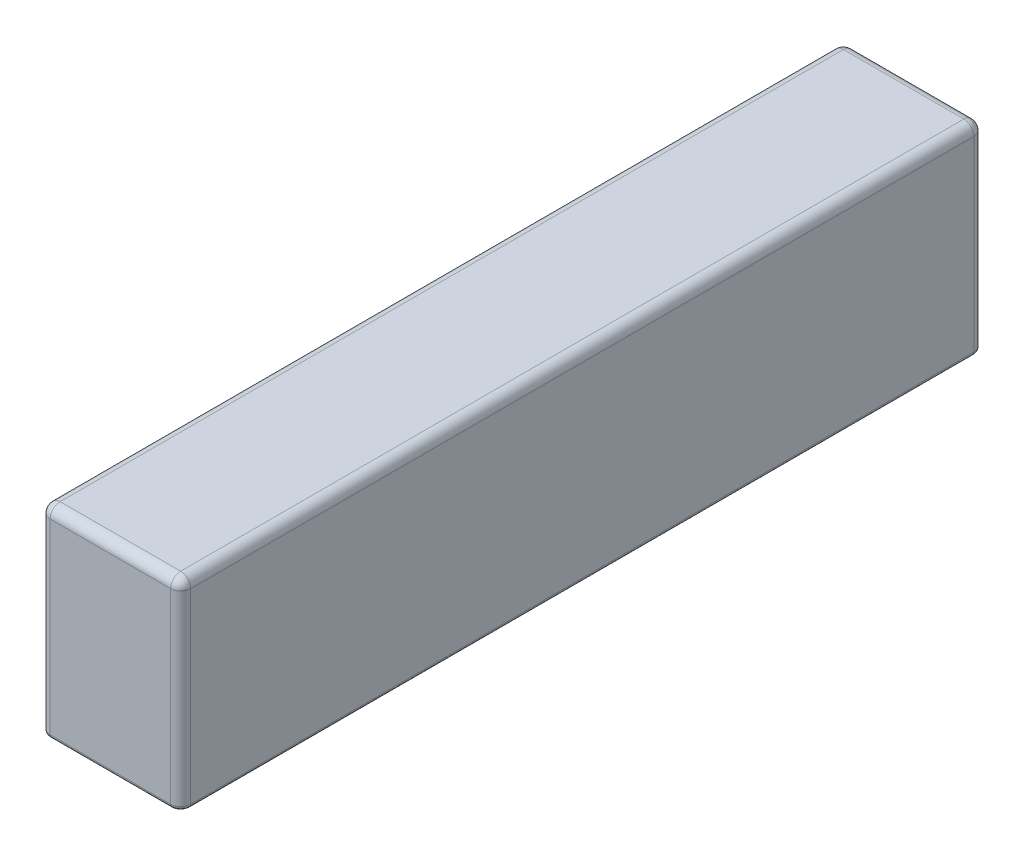
ISO-10303-21;
HEADER;
FILE_DESCRIPTION(('STEP AP214'),'2;1');
FILE_NAME('part.step','',(''),(''),'','','');
FILE_SCHEMA(('AUTOMOTIVE_DESIGN { 1 0 10303 214 1 1 1 1 }'));
ENDSEC;
DATA;
#1=APPLICATION_CONTEXT('core data for automotive mechanical design processes');
#2=APPLICATION_PROTOCOL_DEFINITION('international standard','automotive_design',2000,#1);
#3=PRODUCT_CONTEXT('',#1,'mechanical');
#4=PRODUCT('Part','Part','',(#3));
#5=PRODUCT_RELATED_PRODUCT_CATEGORY('part','',(#4));
#6=PRODUCT_DEFINITION_FORMATION('','',#4);
#7=PRODUCT_DEFINITION_CONTEXT('part definition',#1,'design');
#8=PRODUCT_DEFINITION('design','',#6,#7);
#9=PRODUCT_DEFINITION_SHAPE('','',#8);
#10=(LENGTH_UNIT() NAMED_UNIT(*) SI_UNIT(.MILLI.,.METRE.));
#11=(NAMED_UNIT(*) PLANE_ANGLE_UNIT() SI_UNIT($,.RADIAN.));
#12=(NAMED_UNIT(*) SI_UNIT($,.STERADIAN.) SOLID_ANGLE_UNIT());
#13=UNCERTAINTY_MEASURE_WITH_UNIT(LENGTH_MEASURE(1.E-05),#10,'distance_accuracy_value','');
#14=(GEOMETRIC_REPRESENTATION_CONTEXT(3) GLOBAL_UNCERTAINTY_ASSIGNED_CONTEXT((#13)) GLOBAL_UNIT_ASSIGNED_CONTEXT((#10,
#11,#12)) REPRESENTATION_CONTEXT('',''));
#15=CARTESIAN_POINT('',(0.,0.,0.));
#16=DIRECTION('',(0.,0.,1.));
#17=DIRECTION('',(1.,0.,0.));
#18=AXIS2_PLACEMENT_3D('',#15,#16,#17);
#19=CARTESIAN_POINT('',(3.5,5.,20.));
#20=DIRECTION('',(-1.,0.,0.));
#21=DIRECTION('',(0.,0.,1.));
#22=AXIS2_PLACEMENT_3D('',#19,#20,#21);
#23=PLANE('',#22);
#24=DIRECTION('',(0.,-1.,0.));
#25=VECTOR('',#24,1.);
#26=CARTESIAN_POINT('',(3.5,5.,19.5));
#27=LINE('',#26,#25);
#28=CARTESIAN_POINT('',(3.5,4.5,19.5));
#29=VERTEX_POINT('',#28);
#30=CARTESIAN_POINT('',(3.5,-4.8,19.5));
#31=VERTEX_POINT('',#30);
#32=EDGE_CURVE('E192',#29,#31,#27,.T.);
#33=ORIENTED_EDGE('',*,*,#32,.T.);
#34=DIRECTION('',(0.,0.,-1.));
#35=VECTOR('',#34,1.);
#36=CARTESIAN_POINT('',(3.5,-4.8,-19.5));
#37=LINE('',#36,#35);
#38=CARTESIAN_POINT('',(3.5,-4.8,-19.5));
#39=VERTEX_POINT('',#38);
#40=EDGE_CURVE('E69',#31,#39,#37,.T.);
#41=ORIENTED_EDGE('',*,*,#40,.T.);
#42=DIRECTION('',(0.,-1.,0.));
#43=VECTOR('',#42,1.);
#44=CARTESIAN_POINT('',(3.5,5.,-19.5));
#45=LINE('',#44,#43);
#46=CARTESIAN_POINT('',(3.5,4.5,-19.5));
#47=VERTEX_POINT('',#46);
#48=EDGE_CURVE('E194',#39,#47,#45,.F.);
#49=ORIENTED_EDGE('',*,*,#48,.T.);
#50=DIRECTION('',(0.,0.,-1.));
#51=VECTOR('',#50,1.);
#52=CARTESIAN_POINT('',(3.5,4.5,20.));
#53=LINE('',#52,#51);
#54=EDGE_CURVE('E190',#47,#29,#53,.F.);
#55=ORIENTED_EDGE('',*,*,#54,.T.);
#56=EDGE_LOOP('',(#33,#41,#49,#55));
#57=FACE_BOUND('',#56,.T.);
#58=ADVANCED_FACE('F45',(#57),#23,.F.);
#59=CARTESIAN_POINT('',(-3.5,5.,-20.));
#60=DIRECTION('',(0.,0.,1.));
#61=DIRECTION('',(1.,0.,0.));
#62=AXIS2_PLACEMENT_3D('',#59,#60,#61);
#63=PLANE('',#62);
#64=DIRECTION('',(0.,-1.,0.));
#65=VECTOR('',#64,1.);
#66=CARTESIAN_POINT('',(3.,5.,-20.));
#67=LINE('',#66,#65);
#68=CARTESIAN_POINT('',(3.,4.5,-20.));
#69=VERTEX_POINT('',#68);
#70=CARTESIAN_POINT('',(3.,-4.8,-20.));
#71=VERTEX_POINT('',#70);
#72=EDGE_CURVE('E157',#69,#71,#67,.T.);
#73=ORIENTED_EDGE('',*,*,#72,.T.);
#74=DIRECTION('',(-1.,0.,0.));
#75=VECTOR('',#74,1.);
#76=CARTESIAN_POINT('',(-3.,-4.8,-20.));
#77=LINE('',#76,#75);
#78=CARTESIAN_POINT('',(-3.,-4.8,-20.));
#79=VERTEX_POINT('',#78);
#80=EDGE_CURVE('E11',#71,#79,#77,.T.);
#81=ORIENTED_EDGE('',*,*,#80,.T.);
#82=DIRECTION('',(0.,-1.,0.));
#83=VECTOR('',#82,1.);
#84=CARTESIAN_POINT('',(-3.,5.,-20.));
#85=LINE('',#84,#83);
#86=CARTESIAN_POINT('',(-3.,4.5,-20.));
#87=VERTEX_POINT('',#86);
#88=EDGE_CURVE('E147',#79,#87,#85,.F.);
#89=ORIENTED_EDGE('',*,*,#88,.T.);
#90=DIRECTION('',(-1.,0.,0.));
#91=VECTOR('',#90,1.);
#92=CARTESIAN_POINT('',(-3.5,4.5,-20.));
#93=LINE('',#92,#91);
#94=EDGE_CURVE('E151',#87,#69,#93,.F.);
#95=ORIENTED_EDGE('',*,*,#94,.T.);
#96=EDGE_LOOP('',(#73,#81,#89,#95));
#97=FACE_BOUND('',#96,.T.);
#98=ADVANCED_FACE('F149',(#97),#63,.F.);
#99=CARTESIAN_POINT('',(-3.5,5.,20.));
#100=DIRECTION('',(1.,0.,0.));
#101=DIRECTION('',(0.,0.,-1.));
#102=AXIS2_PLACEMENT_3D('',#99,#100,#101);
#103=PLANE('',#102);
#104=DIRECTION('',(0.,-1.,0.));
#105=VECTOR('',#104,1.);
#106=CARTESIAN_POINT('',(-3.5,5.,-19.5));
#107=LINE('',#106,#105);
#108=CARTESIAN_POINT('',(-3.5,4.5,-19.5));
#109=VERTEX_POINT('',#108);
#110=CARTESIAN_POINT('',(-3.5,-4.8,-19.5));
#111=VERTEX_POINT('',#110);
#112=EDGE_CURVE('E165',#109,#111,#107,.T.);
#113=ORIENTED_EDGE('',*,*,#112,.T.);
#114=DIRECTION('',(0.,0.,1.));
#115=VECTOR('',#114,1.);
#116=CARTESIAN_POINT('',(-3.5,-4.8,19.5));
#117=LINE('',#116,#115);
#118=CARTESIAN_POINT('',(-3.5,-4.8,19.5));
#119=VERTEX_POINT('',#118);
#120=EDGE_CURVE('E256',#111,#119,#117,.T.);
#121=ORIENTED_EDGE('',*,*,#120,.T.);
#122=DIRECTION('',(0.,-1.,0.));
#123=VECTOR('',#122,1.);
#124=CARTESIAN_POINT('',(-3.5,5.,19.5));
#125=LINE('',#124,#123);
#126=CARTESIAN_POINT('',(-3.5,4.5,19.5));
#127=VERTEX_POINT('',#126);
#128=EDGE_CURVE('E206',#119,#127,#125,.F.);
#129=ORIENTED_EDGE('',*,*,#128,.T.);
#130=DIRECTION('',(0.,0.,1.));
#131=VECTOR('',#130,1.);
#132=CARTESIAN_POINT('',(-3.5,4.5,20.));
#133=LINE('',#132,#131);
#134=EDGE_CURVE('E203',#127,#109,#133,.F.);
#135=ORIENTED_EDGE('',*,*,#134,.T.);
#136=EDGE_LOOP('',(#113,#121,#129,#135));
#137=FACE_BOUND('',#136,.T.);
#138=ADVANCED_FACE('F325',(#137),#103,.F.);
#139=CARTESIAN_POINT('',(-3.5,5.,20.));
#140=DIRECTION('',(0.,0.,-1.));
#141=DIRECTION('',(-1.,0.,0.));
#142=AXIS2_PLACEMENT_3D('',#139,#140,#141);
#143=PLANE('',#142);
#144=DIRECTION('',(0.,-1.,0.));
#145=VECTOR('',#144,1.);
#146=CARTESIAN_POINT('',(-3.,5.,20.));
#147=LINE('',#146,#145);
#148=CARTESIAN_POINT('',(-3.,4.5,20.));
#149=VERTEX_POINT('',#148);
#150=CARTESIAN_POINT('',(-3.,-4.8,20.));
#151=VERTEX_POINT('',#150);
#152=EDGE_CURVE('E198',#149,#151,#147,.T.);
#153=ORIENTED_EDGE('',*,*,#152,.T.);
#154=DIRECTION('',(1.,0.,0.));
#155=VECTOR('',#154,1.);
#156=CARTESIAN_POINT('',(3.,-4.8,20.));
#157=LINE('',#156,#155);
#158=CARTESIAN_POINT('',(3.,-4.8,20.));
#159=VERTEX_POINT('',#158);
#160=EDGE_CURVE('E260',#151,#159,#157,.T.);
#161=ORIENTED_EDGE('',*,*,#160,.T.);
#162=DIRECTION('',(0.,-1.,0.));
#163=VECTOR('',#162,1.);
#164=CARTESIAN_POINT('',(3.,5.,20.));
#165=LINE('',#164,#163);
#166=CARTESIAN_POINT('',(3.,4.5,20.));
#167=VERTEX_POINT('',#166);
#168=EDGE_CURVE('E201',#159,#167,#165,.F.);
#169=ORIENTED_EDGE('',*,*,#168,.T.);
#170=DIRECTION('',(1.,0.,0.));
#171=VECTOR('',#170,1.);
#172=CARTESIAN_POINT('',(-3.5,4.5,20.));
#173=LINE('',#172,#171);
#174=EDGE_CURVE('E196',#167,#149,#173,.F.);
#175=ORIENTED_EDGE('',*,*,#174,.T.);
#176=EDGE_LOOP('',(#153,#161,#169,#175));
#177=FACE_BOUND('',#176,.T.);
#178=ADVANCED_FACE('F500',(#177),#143,.F.);
#179=CARTESIAN_POINT('',(0.,5.,0.));
#180=DIRECTION('',(0.,-1.,0.));
#181=DIRECTION('',(0.,0.,-1.));
#182=AXIS2_PLACEMENT_3D('',#179,#180,#181);
#183=PLANE('',#182);
#184=DIRECTION('',(0.,0.,-1.));
#185=VECTOR('',#184,1.);
#186=CARTESIAN_POINT('',(3.,5.,0.));
#187=LINE('',#186,#185);
#188=CARTESIAN_POINT('',(3.,5.,19.5));
#189=VERTEX_POINT('',#188);
#190=CARTESIAN_POINT('',(3.,5.,-19.5));
#191=VERTEX_POINT('',#190);
#192=EDGE_CURVE('E212',#189,#191,#187,.T.);
#193=ORIENTED_EDGE('',*,*,#192,.T.);
#194=DIRECTION('',(-1.,0.,0.));
#195=VECTOR('',#194,1.);
#196=CARTESIAN_POINT('',(0.,5.,-19.5));
#197=LINE('',#196,#195);
#198=CARTESIAN_POINT('',(-3.,5.,-19.5));
#199=VERTEX_POINT('',#198);
#200=EDGE_CURVE('E214',#191,#199,#197,.T.);
#201=ORIENTED_EDGE('',*,*,#200,.T.);
#202=DIRECTION('',(0.,0.,1.));
#203=VECTOR('',#202,1.);
#204=CARTESIAN_POINT('',(-3.,5.,0.));
#205=LINE('',#204,#203);
#206=CARTESIAN_POINT('',(-3.,5.,19.5));
#207=VERTEX_POINT('',#206);
#208=EDGE_CURVE('E208',#199,#207,#205,.T.);
#209=ORIENTED_EDGE('',*,*,#208,.T.);
#210=DIRECTION('',(1.,0.,0.));
#211=VECTOR('',#210,1.);
#212=CARTESIAN_POINT('',(0.,5.,19.5));
#213=LINE('',#212,#211);
#214=EDGE_CURVE('E210',#207,#189,#213,.T.);
#215=ORIENTED_EDGE('',*,*,#214,.T.);
#216=EDGE_LOOP('',(#193,#201,#209,#215));
#217=FACE_BOUND('',#216,.T.);
#218=ADVANCED_FACE('F334',(#217),#183,.F.);
#219=CARTESIAN_POINT('',(0.,-5.,0.));
#220=DIRECTION('',(0.,-1.,0.));
#221=DIRECTION('',(0.,0.,-1.));
#222=AXIS2_PLACEMENT_3D('',#219,#220,#221);
#223=PLANE('',#222);
#224=DIRECTION('',(0.,0.,1.));
#225=VECTOR('',#224,1.);
#226=CARTESIAN_POINT('',(-3.3,-5.,-19.5));
#227=LINE('',#226,#225);
#228=CARTESIAN_POINT('',(-3.3,-5.,19.5));
#229=VERTEX_POINT('',#228);
#230=CARTESIAN_POINT('',(-3.3,-5.,-19.5));
#231=VERTEX_POINT('',#230);
#232=EDGE_CURVE('E249',#229,#231,#227,.F.);
#233=ORIENTED_EDGE('',*,*,#232,.T.);
#234=CARTESIAN_POINT('',(-3.,-5.,-19.5));
#235=DIRECTION('',(0.,-1.,0.));
#236=DIRECTION('',(0.,0.,-1.));
#237=AXIS2_PLACEMENT_3D('',#234,#235,#236);
#238=CIRCLE('',#237,0.3);
#239=CARTESIAN_POINT('',(-3.,-5.,-19.8));
#240=VERTEX_POINT('',#239);
#241=EDGE_CURVE('E251',#231,#240,#238,.T.);
#242=ORIENTED_EDGE('',*,*,#241,.T.);
#243=DIRECTION('',(-1.,0.,0.));
#244=VECTOR('',#243,1.);
#245=CARTESIAN_POINT('',(3.,-5.,-19.8));
#246=LINE('',#245,#244);
#247=CARTESIAN_POINT('',(3.,-5.,-19.8));
#248=VERTEX_POINT('',#247);
#249=EDGE_CURVE('E217',#240,#248,#246,.F.);
#250=ORIENTED_EDGE('',*,*,#249,.T.);
#251=CARTESIAN_POINT('',(3.,-5.,-19.5));
#252=DIRECTION('',(0.,-1.,0.));
#253=DIRECTION('',(0.,0.,-1.));
#254=AXIS2_PLACEMENT_3D('',#251,#252,#253);
#255=CIRCLE('',#254,0.3);
#256=CARTESIAN_POINT('',(3.3,-5.,-19.5));
#257=VERTEX_POINT('',#256);
#258=EDGE_CURVE('E239',#248,#257,#255,.T.);
#259=ORIENTED_EDGE('',*,*,#258,.T.);
#260=DIRECTION('',(0.,0.,-1.));
#261=VECTOR('',#260,1.);
#262=CARTESIAN_POINT('',(3.3,-5.,19.5));
#263=LINE('',#262,#261);
#264=CARTESIAN_POINT('',(3.3,-5.,19.5));
#265=VERTEX_POINT('',#264);
#266=EDGE_CURVE('E241',#257,#265,#263,.F.);
#267=ORIENTED_EDGE('',*,*,#266,.T.);
#268=CARTESIAN_POINT('',(3.,-5.,19.5));
#269=DIRECTION('',(0.,-1.,0.));
#270=DIRECTION('',(0.,0.,-1.));
#271=AXIS2_PLACEMENT_3D('',#268,#269,#270);
#272=CIRCLE('',#271,0.3);
#273=CARTESIAN_POINT('',(3.,-5.,19.8));
#274=VERTEX_POINT('',#273);
#275=EDGE_CURVE('E243',#265,#274,#272,.T.);
#276=ORIENTED_EDGE('',*,*,#275,.T.);
#277=DIRECTION('',(1.,0.,0.));
#278=VECTOR('',#277,1.);
#279=CARTESIAN_POINT('',(-3.,-5.,19.8));
#280=LINE('',#279,#278);
#281=CARTESIAN_POINT('',(-3.,-5.,19.8));
#282=VERTEX_POINT('',#281);
#283=EDGE_CURVE('E245',#274,#282,#280,.F.);
#284=ORIENTED_EDGE('',*,*,#283,.T.);
#285=CARTESIAN_POINT('',(-3.,-5.,19.5));
#286=DIRECTION('',(0.,-1.,0.));
#287=DIRECTION('',(0.,0.,-1.));
#288=AXIS2_PLACEMENT_3D('',#285,#286,#287);
#289=CIRCLE('',#288,0.3);
#290=EDGE_CURVE('E247',#282,#229,#289,.T.);
#291=ORIENTED_EDGE('',*,*,#290,.T.);
#292=EDGE_LOOP('',(#233,#242,#250,#259,#267,#276,#284,#291));
#293=FACE_BOUND('',#292,.T.);
#294=ADVANCED_FACE('F470',(#293),#223,.T.);
#295=CARTESIAN_POINT('',(-3.,5.,19.5));
#296=DIRECTION('',(0.,-1.,0.));
#297=DIRECTION('',(0.,0.,-1.));
#298=AXIS2_PLACEMENT_3D('',#295,#296,#297);
#299=CYLINDRICAL_SURFACE('',#298,0.5);
#300=ORIENTED_EDGE('',*,*,#128,.F.);
#301=CARTESIAN_POINT('',(-3.,-4.8,19.5));
#302=DIRECTION('',(0.,-1.,0.));
#303=DIRECTION('',(0.,0.,-1.));
#304=AXIS2_PLACEMENT_3D('',#301,#302,#303);
#305=CIRCLE('',#304,0.5);
#306=EDGE_CURVE('E258',#119,#151,#305,.F.);
#307=ORIENTED_EDGE('',*,*,#306,.T.);
#308=ORIENTED_EDGE('',*,*,#152,.F.);
#309=CARTESIAN_POINT('',(-3.,4.5,19.5));
#310=DIRECTION('',(0.,1.,0.));
#311=DIRECTION('',(0.,0.,1.));
#312=AXIS2_PLACEMENT_3D('',#309,#310,#311);
#313=CIRCLE('',#312,0.5);
#314=EDGE_CURVE('E183',#127,#149,#313,.T.);
#315=ORIENTED_EDGE('',*,*,#314,.F.);
#316=EDGE_LOOP('',(#300,#307,#308,#315));
#317=FACE_BOUND('',#316,.T.);
#318=ADVANCED_FACE('F466',(#317),#299,.T.);
#319=CARTESIAN_POINT('',(-3.,4.5,19.5));
#320=DIRECTION('',(0.,0.,1.));
#321=DIRECTION('',(1.,0.,0.));
#322=AXIS2_PLACEMENT_3D('',#319,#320,#321);
#323=SPHERICAL_SURFACE('',#322,0.5);
#324=CARTESIAN_POINT('',(-3.,4.5,19.5));
#325=DIRECTION('',(0.,0.,1.));
#326=DIRECTION('',(1.,0.,0.));
#327=AXIS2_PLACEMENT_3D('',#324,#325,#326);
#328=CIRCLE('',#327,0.5);
#329=EDGE_CURVE('E233',#127,#207,#328,.F.);
#330=ORIENTED_EDGE('',*,*,#329,.F.);
#331=ORIENTED_EDGE('',*,*,#314,.T.);
#332=CARTESIAN_POINT('',(-3.,4.5,19.5));
#333=DIRECTION('',(-1.,0.,0.));
#334=DIRECTION('',(0.,0.,1.));
#335=AXIS2_PLACEMENT_3D('',#332,#333,#334);
#336=CIRCLE('',#335,0.5);
#337=EDGE_CURVE('E186',#207,#149,#336,.F.);
#338=ORIENTED_EDGE('',*,*,#337,.F.);
#339=EDGE_LOOP('',(#330,#331,#338));
#340=FACE_BOUND('',#339,.T.);
#341=ADVANCED_FACE('F469',(#340),#323,.T.);
#342=CARTESIAN_POINT('',(3.,5.,19.5));
#343=DIRECTION('',(0.,-1.,0.));
#344=DIRECTION('',(0.,0.,-1.));
#345=AXIS2_PLACEMENT_3D('',#342,#343,#344);
#346=CYLINDRICAL_SURFACE('',#345,0.5);
#347=ORIENTED_EDGE('',*,*,#168,.F.);
#348=CARTESIAN_POINT('',(3.,-4.8,19.5));
#349=DIRECTION('',(0.,-1.,0.));
#350=DIRECTION('',(0.,0.,-1.));
#351=AXIS2_PLACEMENT_3D('',#348,#349,#350);
#352=CIRCLE('',#351,0.5);
#353=EDGE_CURVE('E262',#159,#31,#352,.F.);
#354=ORIENTED_EDGE('',*,*,#353,.T.);
#355=ORIENTED_EDGE('',*,*,#32,.F.);
#356=CARTESIAN_POINT('',(3.,4.5,19.5));
#357=DIRECTION('',(0.,1.,0.));
#358=DIRECTION('',(0.,0.,1.));
#359=AXIS2_PLACEMENT_3D('',#356,#357,#358);
#360=CIRCLE('',#359,0.5);
#361=EDGE_CURVE('E230',#167,#29,#360,.T.);
#362=ORIENTED_EDGE('',*,*,#361,.F.);
#363=EDGE_LOOP('',(#347,#354,#355,#362));
#364=FACE_BOUND('',#363,.T.);
#365=ADVANCED_FACE('F299',(#364),#346,.T.);
#366=CARTESIAN_POINT('',(0.,4.5,19.5));
#367=DIRECTION('',(1.,0.,0.));
#368=DIRECTION('',(0.,0.,-1.));
#369=AXIS2_PLACEMENT_3D('',#366,#367,#368);
#370=CYLINDRICAL_SURFACE('',#369,0.5);
#371=ORIENTED_EDGE('',*,*,#337,.T.);
#372=ORIENTED_EDGE('',*,*,#174,.F.);
#373=CARTESIAN_POINT('',(3.,4.5,19.5));
#374=DIRECTION('',(1.,0.,0.));
#375=DIRECTION('',(0.,0.,-1.));
#376=AXIS2_PLACEMENT_3D('',#373,#374,#375);
#377=CIRCLE('',#376,0.5);
#378=EDGE_CURVE('E227',#189,#167,#377,.T.);
#379=ORIENTED_EDGE('',*,*,#378,.F.);
#380=ORIENTED_EDGE('',*,*,#214,.F.);
#381=EDGE_LOOP('',(#371,#372,#379,#380));
#382=FACE_BOUND('',#381,.T.);
#383=ADVANCED_FACE('F339',(#382),#370,.T.);
#384=CARTESIAN_POINT('',(-3.,4.5,0.));
#385=DIRECTION('',(0.,0.,1.));
#386=DIRECTION('',(1.,0.,0.));
#387=AXIS2_PLACEMENT_3D('',#384,#385,#386);
#388=CYLINDRICAL_SURFACE('',#387,0.5);
#389=ORIENTED_EDGE('',*,*,#329,.T.);
#390=ORIENTED_EDGE('',*,*,#208,.F.);
#391=CARTESIAN_POINT('',(-3.,4.5,-19.5));
#392=DIRECTION('',(0.,0.,-1.));
#393=DIRECTION('',(-1.,0.,0.));
#394=AXIS2_PLACEMENT_3D('',#391,#392,#393);
#395=CIRCLE('',#394,0.5);
#396=EDGE_CURVE('E169',#109,#199,#395,.T.);
#397=ORIENTED_EDGE('',*,*,#396,.F.);
#398=ORIENTED_EDGE('',*,*,#134,.F.);
#399=EDGE_LOOP('',(#389,#390,#397,#398));
#400=FACE_BOUND('',#399,.T.);
#401=ADVANCED_FACE('F330',(#400),#388,.T.);
#402=CARTESIAN_POINT('',(-3.,5.,-19.5));
#403=DIRECTION('',(0.,-1.,0.));
#404=DIRECTION('',(0.,0.,-1.));
#405=AXIS2_PLACEMENT_3D('',#402,#403,#404);
#406=CYLINDRICAL_SURFACE('',#405,0.5);
#407=ORIENTED_EDGE('',*,*,#88,.F.);
#408=CARTESIAN_POINT('',(-3.,-4.8,-19.5));
#409=DIRECTION('',(0.,-1.,0.));
#410=DIRECTION('',(0.,0.,-1.));
#411=AXIS2_PLACEMENT_3D('',#408,#409,#410);
#412=CIRCLE('',#411,0.5);
#413=EDGE_CURVE('E254',#79,#111,#412,.F.);
#414=ORIENTED_EDGE('',*,*,#413,.T.);
#415=ORIENTED_EDGE('',*,*,#112,.F.);
#416=CARTESIAN_POINT('',(-3.,4.5,-19.5));
#417=DIRECTION('',(0.,1.,0.));
#418=DIRECTION('',(0.,0.,1.));
#419=AXIS2_PLACEMENT_3D('',#416,#417,#418);
#420=CIRCLE('',#419,0.5);
#421=EDGE_CURVE('E161',#87,#109,#420,.T.);
#422=ORIENTED_EDGE('',*,*,#421,.F.);
#423=EDGE_LOOP('',(#407,#414,#415,#422));
#424=FACE_BOUND('',#423,.T.);
#425=ADVANCED_FACE('F163',(#424),#406,.T.);
#426=CARTESIAN_POINT('',(3.,4.5,19.5));
#427=DIRECTION('',(0.,0.,1.));
#428=DIRECTION('',(1.,0.,0.));
#429=AXIS2_PLACEMENT_3D('',#426,#427,#428);
#430=SPHERICAL_SURFACE('',#429,0.5);
#431=ORIENTED_EDGE('',*,*,#378,.T.);
#432=ORIENTED_EDGE('',*,*,#361,.T.);
#433=CARTESIAN_POINT('',(3.,4.5,19.5));
#434=DIRECTION('',(0.,0.,1.));
#435=DIRECTION('',(1.,0.,0.));
#436=AXIS2_PLACEMENT_3D('',#433,#434,#435);
#437=CIRCLE('',#436,0.5);
#438=EDGE_CURVE('E170',#189,#29,#437,.F.);
#439=ORIENTED_EDGE('',*,*,#438,.F.);
#440=EDGE_LOOP('',(#431,#432,#439));
#441=FACE_BOUND('',#440,.T.);
#442=ADVANCED_FACE('F341',(#441),#430,.T.);
#443=CARTESIAN_POINT('',(-3.,4.5,-19.5));
#444=DIRECTION('',(-1.,0.,0.));
#445=DIRECTION('',(0.,0.,1.));
#446=AXIS2_PLACEMENT_3D('',#443,#444,#445);
#447=SPHERICAL_SURFACE('',#446,0.5);
#448=ORIENTED_EDGE('',*,*,#421,.T.);
#449=ORIENTED_EDGE('',*,*,#396,.T.);
#450=CARTESIAN_POINT('',(-3.,4.5,-19.5));
#451=DIRECTION('',(-1.,0.,0.));
#452=DIRECTION('',(0.,0.,1.));
#453=AXIS2_PLACEMENT_3D('',#450,#451,#452);
#454=CIRCLE('',#453,0.5);
#455=EDGE_CURVE('E172',#87,#199,#454,.F.);
#456=ORIENTED_EDGE('',*,*,#455,.F.);
#457=EDGE_LOOP('',(#448,#449,#456));
#458=FACE_BOUND('',#457,.T.);
#459=ADVANCED_FACE('F173',(#458),#447,.T.);
#460=CARTESIAN_POINT('',(3.,4.5,0.));
#461=DIRECTION('',(0.,0.,-1.));
#462=DIRECTION('',(-1.,0.,0.));
#463=AXIS2_PLACEMENT_3D('',#460,#461,#462);
#464=CYLINDRICAL_SURFACE('',#463,0.5);
#465=ORIENTED_EDGE('',*,*,#438,.T.);
#466=ORIENTED_EDGE('',*,*,#54,.F.);
#467=CARTESIAN_POINT('',(3.,4.5,-19.5));
#468=DIRECTION('',(0.,0.,-1.));
#469=DIRECTION('',(-1.,0.,0.));
#470=AXIS2_PLACEMENT_3D('',#467,#468,#469);
#471=CIRCLE('',#470,0.5);
#472=EDGE_CURVE('E177',#191,#47,#471,.T.);
#473=ORIENTED_EDGE('',*,*,#472,.F.);
#474=ORIENTED_EDGE('',*,*,#192,.F.);
#475=EDGE_LOOP('',(#465,#466,#473,#474));
#476=FACE_BOUND('',#475,.T.);
#477=ADVANCED_FACE('F304',(#476),#464,.T.);
#478=CARTESIAN_POINT('',(0.,4.5,-19.5));
#479=DIRECTION('',(-1.,0.,0.));
#480=DIRECTION('',(0.,0.,1.));
#481=AXIS2_PLACEMENT_3D('',#478,#479,#480);
#482=CYLINDRICAL_SURFACE('',#481,0.5);
#483=ORIENTED_EDGE('',*,*,#455,.T.);
#484=ORIENTED_EDGE('',*,*,#200,.F.);
#485=CARTESIAN_POINT('',(3.,4.5,-19.5));
#486=DIRECTION('',(1.,0.,0.));
#487=DIRECTION('',(0.,1.,0.));
#488=AXIS2_PLACEMENT_3D('',#485,#486,#487);
#489=CIRCLE('',#488,0.5);
#490=EDGE_CURVE('E181',#69,#191,#489,.T.);
#491=ORIENTED_EDGE('',*,*,#490,.F.);
#492=ORIENTED_EDGE('',*,*,#94,.F.);
#493=EDGE_LOOP('',(#483,#484,#491,#492));
#494=FACE_BOUND('',#493,.T.);
#495=ADVANCED_FACE('F179',(#494),#482,.T.);
#496=CARTESIAN_POINT('',(3.,4.5,-19.5));
#497=DIRECTION('',(0.,1.,0.));
#498=DIRECTION('',(0.,0.,1.));
#499=AXIS2_PLACEMENT_3D('',#496,#497,#498);
#500=SPHERICAL_SURFACE('',#499,0.5);
#501=ORIENTED_EDGE('',*,*,#490,.T.);
#502=ORIENTED_EDGE('',*,*,#472,.T.);
#503=CARTESIAN_POINT('',(3.,4.5,-19.5));
#504=DIRECTION('',(0.,1.,0.));
#505=DIRECTION('',(0.,0.,1.));
#506=AXIS2_PLACEMENT_3D('',#503,#504,#505);
#507=CIRCLE('',#506,0.5);
#508=EDGE_CURVE('E218',#69,#47,#507,.F.);
#509=ORIENTED_EDGE('',*,*,#508,.F.);
#510=EDGE_LOOP('',(#501,#502,#509));
#511=FACE_BOUND('',#510,.T.);
#512=ADVANCED_FACE('F308',(#511),#500,.T.);
#513=CARTESIAN_POINT('',(3.,5.,-19.5));
#514=DIRECTION('',(0.,-1.,0.));
#515=DIRECTION('',(0.,0.,-1.));
#516=AXIS2_PLACEMENT_3D('',#513,#514,#515);
#517=CYLINDRICAL_SURFACE('',#516,0.5);
#518=ORIENTED_EDGE('',*,*,#48,.F.);
#519=CARTESIAN_POINT('',(3.,-4.8,-19.5));
#520=DIRECTION('',(0.,-1.,0.));
#521=DIRECTION('',(0.,0.,-1.));
#522=AXIS2_PLACEMENT_3D('',#519,#520,#521);
#523=CIRCLE('',#522,0.5);
#524=EDGE_CURVE('E54',#39,#71,#523,.F.);
#525=ORIENTED_EDGE('',*,*,#524,.T.);
#526=ORIENTED_EDGE('',*,*,#72,.F.);
#527=ORIENTED_EDGE('',*,*,#508,.T.);
#528=EDGE_LOOP('',(#518,#525,#526,#527));
#529=FACE_BOUND('',#528,.T.);
#530=ADVANCED_FACE('F309',(#529),#517,.T.);
#531=CARTESIAN_POINT('',(3.,-4.8,19.5));
#532=DIRECTION('',(0.,-1.,0.));
#533=DIRECTION('',(0.,0.,-1.));
#534=AXIS2_PLACEMENT_3D('',#531,#532,#533);
#535=TOROIDAL_SURFACE('',#534,0.3,0.2);
#536=CARTESIAN_POINT('',(3.3,-4.8,19.5));
#537=DIRECTION('',(0.,0.,-1.));
#538=DIRECTION('',(-1.,0.,0.));
#539=AXIS2_PLACEMENT_3D('',#536,#537,#538);
#540=CIRCLE('',#539,0.2);
#541=EDGE_CURVE('E281',#31,#265,#540,.T.);
#542=ORIENTED_EDGE('',*,*,#541,.F.);
#543=ORIENTED_EDGE('',*,*,#353,.F.);
#544=CARTESIAN_POINT('',(3.,-4.8,19.8));
#545=DIRECTION('',(-1.,0.,0.));
#546=DIRECTION('',(0.,0.,1.));
#547=AXIS2_PLACEMENT_3D('',#544,#545,#546);
#548=CIRCLE('',#547,0.2);
#549=EDGE_CURVE('E49',#274,#159,#548,.T.);
#550=ORIENTED_EDGE('',*,*,#549,.F.);
#551=ORIENTED_EDGE('',*,*,#275,.F.);
#552=EDGE_LOOP('',(#542,#543,#550,#551));
#553=FACE_BOUND('',#552,.T.);
#554=ADVANCED_FACE('F47',(#553),#535,.T.);
#555=CARTESIAN_POINT('',(-3.5,-4.8,19.8));
#556=DIRECTION('',(-1.,0.,0.));
#557=DIRECTION('',(0.,0.,1.));
#558=AXIS2_PLACEMENT_3D('',#555,#556,#557);
#559=CYLINDRICAL_SURFACE('',#558,0.2);
#560=ORIENTED_EDGE('',*,*,#549,.T.);
#561=ORIENTED_EDGE('',*,*,#160,.F.);
#562=CARTESIAN_POINT('',(-3.,-4.8,19.8));
#563=DIRECTION('',(-1.,0.,0.));
#564=DIRECTION('',(0.,0.,1.));
#565=AXIS2_PLACEMENT_3D('',#562,#563,#564);
#566=CIRCLE('',#565,0.2);
#567=EDGE_CURVE('E279',#282,#151,#566,.T.);
#568=ORIENTED_EDGE('',*,*,#567,.F.);
#569=ORIENTED_EDGE('',*,*,#283,.F.);
#570=EDGE_LOOP('',(#560,#561,#568,#569));
#571=FACE_BOUND('',#570,.T.);
#572=ADVANCED_FACE('F291',(#571),#559,.T.);
#573=CARTESIAN_POINT('',(3.3,-4.8,20.));
#574=DIRECTION('',(0.,0.,1.));
#575=DIRECTION('',(1.,0.,0.));
#576=AXIS2_PLACEMENT_3D('',#573,#574,#575);
#577=CYLINDRICAL_SURFACE('',#576,0.2);
#578=ORIENTED_EDGE('',*,*,#541,.T.);
#579=ORIENTED_EDGE('',*,*,#266,.F.);
#580=CARTESIAN_POINT('',(3.3,-4.8,-19.5));
#581=DIRECTION('',(0.,0.,-1.));
#582=DIRECTION('',(-1.,0.,0.));
#583=AXIS2_PLACEMENT_3D('',#580,#581,#582);
#584=CIRCLE('',#583,0.2);
#585=EDGE_CURVE('E276',#39,#257,#584,.T.);
#586=ORIENTED_EDGE('',*,*,#585,.F.);
#587=ORIENTED_EDGE('',*,*,#40,.F.);
#588=EDGE_LOOP('',(#578,#579,#586,#587));
#589=FACE_BOUND('',#588,.T.);
#590=ADVANCED_FACE('F404',(#589),#577,.T.);
#591=CARTESIAN_POINT('',(-3.,-4.8,19.5));
#592=DIRECTION('',(0.,-1.,0.));
#593=DIRECTION('',(0.,0.,-1.));
#594=AXIS2_PLACEMENT_3D('',#591,#592,#593);
#595=TOROIDAL_SURFACE('',#594,0.3,0.2);
#596=ORIENTED_EDGE('',*,*,#567,.T.);
#597=ORIENTED_EDGE('',*,*,#306,.F.);
#598=CARTESIAN_POINT('',(-3.3,-4.8,19.5));
#599=DIRECTION('',(0.,0.,-1.));
#600=DIRECTION('',(-1.,0.,0.));
#601=AXIS2_PLACEMENT_3D('',#598,#599,#600);
#602=CIRCLE('',#601,0.2);
#603=EDGE_CURVE('E273',#229,#119,#602,.T.);
#604=ORIENTED_EDGE('',*,*,#603,.F.);
#605=ORIENTED_EDGE('',*,*,#290,.F.);
#606=EDGE_LOOP('',(#596,#597,#604,#605));
#607=FACE_BOUND('',#606,.T.);
#608=ADVANCED_FACE('F412',(#607),#595,.T.);
#609=CARTESIAN_POINT('',(3.,-4.8,-19.5));
#610=DIRECTION('',(0.,-1.,0.));
#611=DIRECTION('',(0.,0.,-1.));
#612=AXIS2_PLACEMENT_3D('',#609,#610,#611);
#613=TOROIDAL_SURFACE('',#612,0.3,0.2);
#614=ORIENTED_EDGE('',*,*,#585,.T.);
#615=ORIENTED_EDGE('',*,*,#258,.F.);
#616=CARTESIAN_POINT('',(3.,-4.8,-19.8));
#617=DIRECTION('',(-1.,0.,0.));
#618=DIRECTION('',(0.,0.,1.));
#619=AXIS2_PLACEMENT_3D('',#616,#617,#618);
#620=CIRCLE('',#619,0.2);
#621=EDGE_CURVE('E270',#71,#248,#620,.T.);
#622=ORIENTED_EDGE('',*,*,#621,.F.);
#623=ORIENTED_EDGE('',*,*,#524,.F.);
#624=EDGE_LOOP('',(#614,#615,#622,#623));
#625=FACE_BOUND('',#624,.T.);
#626=ADVANCED_FACE('F314',(#625),#613,.T.);
#627=CARTESIAN_POINT('',(-3.3,-4.8,20.));
#628=DIRECTION('',(0.,0.,-1.));
#629=DIRECTION('',(-1.,0.,0.));
#630=AXIS2_PLACEMENT_3D('',#627,#628,#629);
#631=CYLINDRICAL_SURFACE('',#630,0.2);
#632=ORIENTED_EDGE('',*,*,#603,.T.);
#633=ORIENTED_EDGE('',*,*,#120,.F.);
#634=CARTESIAN_POINT('',(-3.3,-4.8,-19.5));
#635=DIRECTION('',(0.,0.,-1.));
#636=DIRECTION('',(-1.,0.,0.));
#637=AXIS2_PLACEMENT_3D('',#634,#635,#636);
#638=CIRCLE('',#637,0.2);
#639=EDGE_CURVE('E268',#231,#111,#638,.T.);
#640=ORIENTED_EDGE('',*,*,#639,.F.);
#641=ORIENTED_EDGE('',*,*,#232,.F.);
#642=EDGE_LOOP('',(#632,#633,#640,#641));
#643=FACE_BOUND('',#642,.T.);
#644=ADVANCED_FACE('F431',(#643),#631,.T.);
#645=CARTESIAN_POINT('',(-3.5,-4.8,-19.8));
#646=DIRECTION('',(1.,0.,0.));
#647=DIRECTION('',(0.,0.,-1.));
#648=AXIS2_PLACEMENT_3D('',#645,#646,#647);
#649=CYLINDRICAL_SURFACE('',#648,0.2);
#650=ORIENTED_EDGE('',*,*,#621,.T.);
#651=ORIENTED_EDGE('',*,*,#249,.F.);
#652=CARTESIAN_POINT('',(-3.,-4.8,-19.8));
#653=DIRECTION('',(-1.,0.,0.));
#654=DIRECTION('',(0.,0.,1.));
#655=AXIS2_PLACEMENT_3D('',#652,#653,#654);
#656=CIRCLE('',#655,0.2);
#657=EDGE_CURVE('E266',#79,#240,#656,.T.);
#658=ORIENTED_EDGE('',*,*,#657,.F.);
#659=ORIENTED_EDGE('',*,*,#80,.F.);
#660=EDGE_LOOP('',(#650,#651,#658,#659));
#661=FACE_BOUND('',#660,.T.);
#662=ADVANCED_FACE('F318',(#661),#649,.T.);
#663=CARTESIAN_POINT('',(-3.,-4.8,-19.5));
#664=DIRECTION('',(0.,-1.,0.));
#665=DIRECTION('',(0.,0.,-1.));
#666=AXIS2_PLACEMENT_3D('',#663,#664,#665);
#667=TOROIDAL_SURFACE('',#666,0.3,0.2);
#668=ORIENTED_EDGE('',*,*,#639,.T.);
#669=ORIENTED_EDGE('',*,*,#413,.F.);
#670=ORIENTED_EDGE('',*,*,#657,.T.);
#671=ORIENTED_EDGE('',*,*,#241,.F.);
#672=EDGE_LOOP('',(#668,#669,#670,#671));
#673=FACE_BOUND('',#672,.T.);
#674=ADVANCED_FACE('F321',(#673),#667,.T.);
#675=CLOSED_SHELL('',(#58,#98,#138,#178,#218,#294,#318,#341,#365,#383,#401,#425,#442,#459,#477,
#495,#512,#530,#554,#572,#590,#608,#626,#644,#662,#674));
#676=MANIFOLD_SOLID_BREP('B2',#675);
#677=ADVANCED_BREP_SHAPE_REPRESENTATION('',(#18,#676),#14);
#678=SHAPE_DEFINITION_REPRESENTATION(#9,#677);
ENDSEC;
END-ISO-10303-21;
